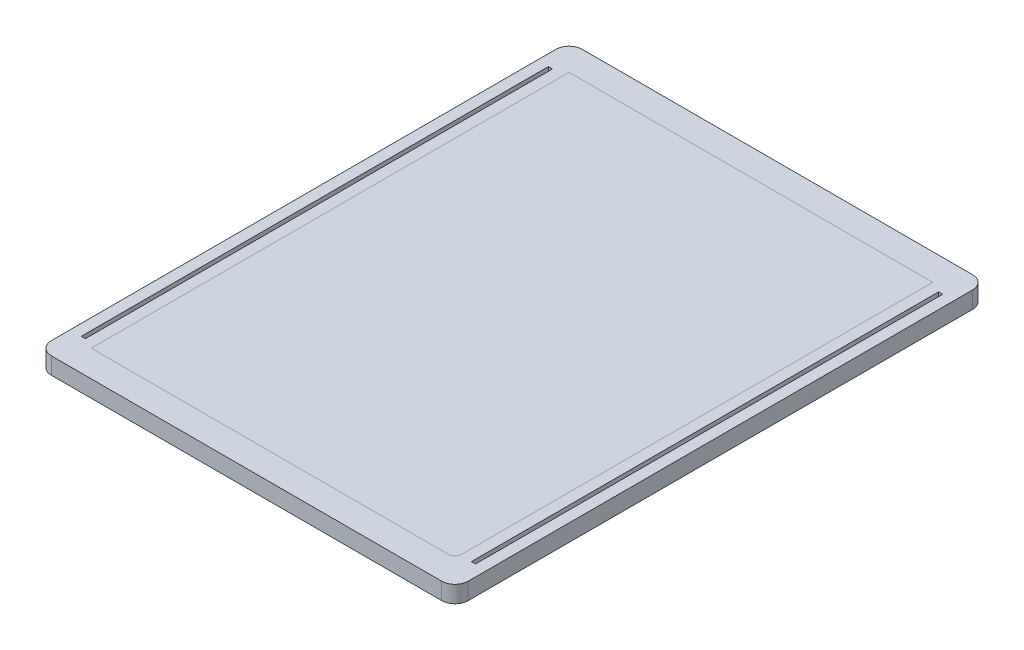
ISO-10303-21;
HEADER;
FILE_DESCRIPTION(('STEP AP214'),'2;1');
FILE_NAME('part.step','',(''),(''),'','','');
FILE_SCHEMA(('AUTOMOTIVE_DESIGN { 1 0 10303 214 1 1 1 1 }'));
ENDSEC;
DATA;
#1=APPLICATION_CONTEXT('core data for automotive mechanical design processes');
#2=APPLICATION_PROTOCOL_DEFINITION('international standard','automotive_design',2000,#1);
#3=PRODUCT_CONTEXT('',#1,'mechanical');
#4=PRODUCT('Part','Part','',(#3));
#5=PRODUCT_RELATED_PRODUCT_CATEGORY('part','',(#4));
#6=PRODUCT_DEFINITION_FORMATION('','',#4);
#7=PRODUCT_DEFINITION_CONTEXT('part definition',#1,'design');
#8=PRODUCT_DEFINITION('design','',#6,#7);
#9=PRODUCT_DEFINITION_SHAPE('','',#8);
#10=(LENGTH_UNIT() NAMED_UNIT(*) SI_UNIT(.MILLI.,.METRE.));
#11=(NAMED_UNIT(*) PLANE_ANGLE_UNIT() SI_UNIT($,.RADIAN.));
#12=(NAMED_UNIT(*) SI_UNIT($,.STERADIAN.) SOLID_ANGLE_UNIT());
#13=UNCERTAINTY_MEASURE_WITH_UNIT(LENGTH_MEASURE(1.E-05),#10,'distance_accuracy_value','');
#14=(GEOMETRIC_REPRESENTATION_CONTEXT(3) GLOBAL_UNCERTAINTY_ASSIGNED_CONTEXT((#13)) GLOBAL_UNIT_ASSIGNED_CONTEXT((#10,
#11,#12)) REPRESENTATION_CONTEXT('',''));
#15=CARTESIAN_POINT('',(0.,0.,0.));
#16=DIRECTION('',(0.,0.,1.));
#17=DIRECTION('',(1.,0.,0.));
#18=AXIS2_PLACEMENT_3D('',#15,#16,#17);
#19=CARTESIAN_POINT('',(68.5000000000001,0.,0.));
#20=DIRECTION('',(-1.,0.,0.));
#21=DIRECTION('',(0.,0.,1.));
#22=AXIS2_PLACEMENT_3D('',#19,#20,#21);
#23=PLANE('',#22);
#24=DIRECTION('',(0.,-1.,0.));
#25=VECTOR('',#24,1.);
#26=CARTESIAN_POINT('',(68.5000000000001,3.175,-90.));
#27=LINE('',#26,#25);
#28=CARTESIAN_POINT('',(68.5000000000001,3.175,-90.));
#29=VERTEX_POINT('',#28);
#30=CARTESIAN_POINT('',(68.5000000000001,-3.175,-90.));
#31=VERTEX_POINT('',#30);
#32=EDGE_CURVE('E99',#29,#31,#27,.T.);
#33=ORIENTED_EDGE('',*,*,#32,.F.);
#34=DIRECTION('',(0.,0.,-1.));
#35=VECTOR('',#34,1.);
#36=CARTESIAN_POINT('',(68.5,3.175,90.));
#37=LINE('',#36,#35);
#38=CARTESIAN_POINT('',(68.5,3.175,90.));
#39=VERTEX_POINT('',#38);
#40=EDGE_CURVE('E110',#39,#29,#37,.T.);
#41=ORIENTED_EDGE('',*,*,#40,.F.);
#42=DIRECTION('',(0.,1.,0.));
#43=VECTOR('',#42,1.);
#44=CARTESIAN_POINT('',(68.5,-3.175,90.));
#45=LINE('',#44,#43);
#46=CARTESIAN_POINT('',(68.5,-3.175,90.));
#47=VERTEX_POINT('',#46);
#48=EDGE_CURVE('E101',#47,#39,#45,.T.);
#49=ORIENTED_EDGE('',*,*,#48,.F.);
#50=DIRECTION('',(0.,0.,1.));
#51=VECTOR('',#50,1.);
#52=CARTESIAN_POINT('',(68.5000000000001,-3.175,-90.));
#53=LINE('',#52,#51);
#54=EDGE_CURVE('E91',#31,#47,#53,.T.);
#55=ORIENTED_EDGE('',*,*,#54,.F.);
#56=EDGE_LOOP('',(#33,#41,#49,#55));
#57=FACE_BOUND('',#56,.T.);
#58=ADVANCED_FACE('F49',(#57),#23,.F.);
#59=CARTESIAN_POINT('',(-248.611972117347,3.175,90.));
#60=DIRECTION('',(0.,-1.,0.));
#61=DIRECTION('',(0.,0.,-1.));
#62=AXIS2_PLACEMENT_3D('',#59,#60,#61);
#63=PLANE('',#62);
#64=DIRECTION('',(1.,0.,0.));
#65=VECTOR('',#64,1.);
#66=CARTESIAN_POINT('',(-248.611972117347,3.175,-90.));
#67=LINE('',#66,#65);
#68=CARTESIAN_POINT('',(-68.5,3.175,-90.));
#69=VERTEX_POINT('',#68);
#70=EDGE_CURVE('E104',#69,#29,#67,.T.);
#71=ORIENTED_EDGE('',*,*,#70,.F.);
#72=DIRECTION('',(0.,0.,1.));
#73=VECTOR('',#72,1.);
#74=CARTESIAN_POINT('',(-68.5,3.175,90.));
#75=LINE('',#74,#73);
#76=CARTESIAN_POINT('',(-68.5,3.175,90.));
#77=VERTEX_POINT('',#76);
#78=EDGE_CURVE('E53',#69,#77,#75,.T.);
#79=ORIENTED_EDGE('',*,*,#78,.T.);
#80=DIRECTION('',(1.,0.,0.));
#81=VECTOR('',#80,1.);
#82=CARTESIAN_POINT('',(-248.611972117347,3.175,90.));
#83=LINE('',#82,#81);
#84=EDGE_CURVE('E113',#77,#39,#83,.T.);
#85=ORIENTED_EDGE('',*,*,#84,.T.);
#86=ORIENTED_EDGE('',*,*,#40,.T.);
#87=EDGE_LOOP('',(#71,#79,#85,#86));
#88=FACE_BOUND('',#87,.T.);
#89=ADVANCED_FACE('F122',(#88),#63,.F.);
#90=CARTESIAN_POINT('',(-248.611972117347,-3.175,90.));
#91=DIRECTION('',(0.,0.,-1.));
#92=DIRECTION('',(-1.,0.,0.));
#93=AXIS2_PLACEMENT_3D('',#90,#91,#92);
#94=PLANE('',#93);
#95=ORIENTED_EDGE('',*,*,#84,.F.);
#96=DIRECTION('',(0.,-1.,0.));
#97=VECTOR('',#96,1.);
#98=CARTESIAN_POINT('',(-68.5,-3.175,90.));
#99=LINE('',#98,#97);
#100=CARTESIAN_POINT('',(-68.5,-3.175,90.));
#101=VERTEX_POINT('',#100);
#102=EDGE_CURVE('E119',#77,#101,#99,.T.);
#103=ORIENTED_EDGE('',*,*,#102,.T.);
#104=DIRECTION('',(1.,0.,0.));
#105=VECTOR('',#104,1.);
#106=CARTESIAN_POINT('',(-248.611972117347,-3.175,90.));
#107=LINE('',#106,#105);
#108=EDGE_CURVE('E95',#101,#47,#107,.T.);
#109=ORIENTED_EDGE('',*,*,#108,.T.);
#110=ORIENTED_EDGE('',*,*,#48,.T.);
#111=EDGE_LOOP('',(#95,#103,#109,#110));
#112=FACE_BOUND('',#111,.T.);
#113=ADVANCED_FACE('F118',(#112),#94,.F.);
#114=CARTESIAN_POINT('',(-248.611972117347,-3.175,-90.));
#115=DIRECTION('',(0.,1.,0.));
#116=DIRECTION('',(0.,0.,1.));
#117=AXIS2_PLACEMENT_3D('',#114,#115,#116);
#118=PLANE('',#117);
#119=ORIENTED_EDGE('',*,*,#108,.F.);
#120=DIRECTION('',(0.,0.,-1.));
#121=VECTOR('',#120,1.);
#122=CARTESIAN_POINT('',(-68.5,-3.175,-90.));
#123=LINE('',#122,#121);
#124=CARTESIAN_POINT('',(-68.5,-3.175,-90.));
#125=VERTEX_POINT('',#124);
#126=EDGE_CURVE('E58',#101,#125,#123,.T.);
#127=ORIENTED_EDGE('',*,*,#126,.T.);
#128=DIRECTION('',(1.,0.,0.));
#129=VECTOR('',#128,1.);
#130=CARTESIAN_POINT('',(-248.611972117347,-3.175,-90.));
#131=LINE('',#130,#129);
#132=EDGE_CURVE('E88',#125,#31,#131,.T.);
#133=ORIENTED_EDGE('',*,*,#132,.T.);
#134=ORIENTED_EDGE('',*,*,#54,.T.);
#135=EDGE_LOOP('',(#119,#127,#133,#134));
#136=FACE_BOUND('',#135,.T.);
#137=ADVANCED_FACE('F90',(#136),#118,.F.);
#138=CARTESIAN_POINT('',(-248.611972117347,3.175,-90.));
#139=DIRECTION('',(0.,0.,1.));
#140=DIRECTION('',(1.,0.,0.));
#141=AXIS2_PLACEMENT_3D('',#138,#139,#140);
#142=PLANE('',#141);
#143=ORIENTED_EDGE('',*,*,#132,.F.);
#144=DIRECTION('',(0.,1.,0.));
#145=VECTOR('',#144,1.);
#146=CARTESIAN_POINT('',(-68.5,3.175,-90.));
#147=LINE('',#146,#145);
#148=EDGE_CURVE('E12',#125,#69,#147,.T.);
#149=ORIENTED_EDGE('',*,*,#148,.T.);
#150=ORIENTED_EDGE('',*,*,#70,.T.);
#151=ORIENTED_EDGE('',*,*,#32,.T.);
#152=EDGE_LOOP('',(#143,#149,#150,#151));
#153=FACE_BOUND('',#152,.T.);
#154=ADVANCED_FACE('F51',(#153),#142,.F.);
#155=CARTESIAN_POINT('',(-68.5,3.175,90.));
#156=DIRECTION('',(1.,0.,0.));
#157=DIRECTION('',(0.,0.,-1.));
#158=AXIS2_PLACEMENT_3D('',#155,#156,#157);
#159=PLANE('',#158);
#160=ORIENTED_EDGE('',*,*,#126,.F.);
#161=ORIENTED_EDGE('',*,*,#102,.F.);
#162=ORIENTED_EDGE('',*,*,#78,.F.);
#163=ORIENTED_EDGE('',*,*,#148,.F.);
#164=EDGE_LOOP('',(#160,#161,#162,#163));
#165=FACE_BOUND('',#164,.T.);
#166=ADVANCED_FACE('F136',(#165),#159,.F.);
#167=CLOSED_SHELL('',(#58,#89,#113,#137,#154,#166));
#168=MANIFOLD_SOLID_BREP('B2_NOT_SHOWN',#167);
#169=CARTESIAN_POINT('',(0.,3.175,0.));
#170=DIRECTION('',(0.,-1.,0.));
#171=DIRECTION('',(0.,0.,-1.));
#172=AXIS2_PLACEMENT_3D('',#169,#170,#171);
#173=PLANE('',#172);
#174=DIRECTION('',(0.,0.,1.));
#175=VECTOR('',#174,1.);
#176=CARTESIAN_POINT('',(-68.5,3.175,90.));
#177=LINE('',#176,#175);
#178=CARTESIAN_POINT('',(-68.5,3.175,-87.4999999999999));
#179=VERTEX_POINT('',#178);
#180=CARTESIAN_POINT('',(-68.5,3.175,87.5));
#181=VERTEX_POINT('',#180);
#182=EDGE_CURVE('E409',#179,#181,#177,.T.);
#183=ORIENTED_EDGE('',*,*,#182,.F.);
#184=CARTESIAN_POINT('',(-66.,3.175,-87.5));
#185=DIRECTION('',(0.,-1.,0.));
#186=DIRECTION('',(0.,0.,-1.));
#187=AXIS2_PLACEMENT_3D('',#184,#185,#186);
#188=CIRCLE('',#187,2.5);
#189=CARTESIAN_POINT('',(-66.,3.175,-90.));
#190=VERTEX_POINT('',#189);
#191=EDGE_CURVE('E47',#179,#190,#188,.T.);
#192=ORIENTED_EDGE('',*,*,#191,.T.);
#193=DIRECTION('',(-1.,0.,0.));
#194=VECTOR('',#193,1.);
#195=CARTESIAN_POINT('',(-68.5,3.175,-90.));
#196=LINE('',#195,#194);
#197=CARTESIAN_POINT('',(66.,3.175,-90.));
#198=VERTEX_POINT('',#197);
#199=EDGE_CURVE('E419',#198,#190,#196,.T.);
#200=ORIENTED_EDGE('',*,*,#199,.F.);
#201=CARTESIAN_POINT('',(66.0000000000001,3.175,-87.5));
#202=DIRECTION('',(0.,-1.,0.));
#203=DIRECTION('',(0.,0.,-1.));
#204=AXIS2_PLACEMENT_3D('',#201,#202,#203);
#205=CIRCLE('',#204,2.5);
#206=CARTESIAN_POINT('',(68.5000000000001,3.175,-87.4999999999999));
#207=VERTEX_POINT('',#206);
#208=EDGE_CURVE('E520',#198,#207,#205,.T.);
#209=ORIENTED_EDGE('',*,*,#208,.T.);
#210=DIRECTION('',(0.,0.,-1.));
#211=VECTOR('',#210,1.);
#212=CARTESIAN_POINT('',(68.5000000000001,3.175,90.));
#213=LINE('',#212,#211);
#214=CARTESIAN_POINT('',(68.5000000000001,3.175,87.5));
#215=VERTEX_POINT('',#214);
#216=EDGE_CURVE('E416',#215,#207,#213,.T.);
#217=ORIENTED_EDGE('',*,*,#216,.F.);
#218=CARTESIAN_POINT('',(66.0000000000001,3.175,87.5));
#219=DIRECTION('',(0.,-1.,0.));
#220=DIRECTION('',(0.,0.,-1.));
#221=AXIS2_PLACEMENT_3D('',#218,#219,#220);
#222=CIRCLE('',#221,2.5);
#223=CARTESIAN_POINT('',(66.0000000000001,3.175,90.));
#224=VERTEX_POINT('',#223);
#225=EDGE_CURVE('E516',#215,#224,#222,.T.);
#226=ORIENTED_EDGE('',*,*,#225,.T.);
#227=DIRECTION('',(1.,0.,0.));
#228=VECTOR('',#227,1.);
#229=CARTESIAN_POINT('',(-68.5,3.175,90.));
#230=LINE('',#229,#228);
#231=CARTESIAN_POINT('',(-66.,3.175,90.));
#232=VERTEX_POINT('',#231);
#233=EDGE_CURVE('E412',#232,#224,#230,.T.);
#234=ORIENTED_EDGE('',*,*,#233,.F.);
#235=CARTESIAN_POINT('',(-66.,3.175,87.5));
#236=DIRECTION('',(0.,-1.,0.));
#237=DIRECTION('',(0.,0.,-1.));
#238=AXIS2_PLACEMENT_3D('',#235,#236,#237);
#239=CIRCLE('',#238,2.5);
#240=EDGE_CURVE('E512',#232,#181,#239,.T.);
#241=ORIENTED_EDGE('',*,*,#240,.T.);
#242=EDGE_LOOP('',(#183,#192,#200,#209,#217,#226,#234,#241));
#243=FACE_BOUND('',#242,.T.);
#244=DIRECTION('',(-1.,0.,0.));
#245=VECTOR('',#244,1.);
#246=CARTESIAN_POINT('',(-78.5,3.175,-100.));
#247=LINE('',#246,#245);
#248=CARTESIAN_POINT('',(73.5,3.175,-100.));
#249=VERTEX_POINT('',#248);
#250=CARTESIAN_POINT('',(-73.5,3.175,-100.));
#251=VERTEX_POINT('',#250);
#252=EDGE_CURVE('E435',#249,#251,#247,.T.);
#253=ORIENTED_EDGE('',*,*,#252,.T.);
#254=CARTESIAN_POINT('',(-73.5,3.175,-95.));
#255=DIRECTION('',(0.,-1.,0.));
#256=DIRECTION('',(0.,0.,-1.));
#257=AXIS2_PLACEMENT_3D('',#254,#255,#256);
#258=CIRCLE('',#257,5.);
#259=CARTESIAN_POINT('',(-78.5,3.175,-95.));
#260=VERTEX_POINT('',#259);
#261=EDGE_CURVE('E479',#251,#260,#258,.F.);
#262=ORIENTED_EDGE('',*,*,#261,.T.);
#263=DIRECTION('',(0.,0.,1.));
#264=VECTOR('',#263,1.);
#265=CARTESIAN_POINT('',(-78.5,3.175,100.));
#266=LINE('',#265,#264);
#267=CARTESIAN_POINT('',(-78.5,3.175,95.));
#268=VERTEX_POINT('',#267);
#269=EDGE_CURVE('E439',#260,#268,#266,.T.);
#270=ORIENTED_EDGE('',*,*,#269,.T.);
#271=CARTESIAN_POINT('',(-73.5,3.175,95.));
#272=DIRECTION('',(0.,-1.,0.));
#273=DIRECTION('',(0.,0.,-1.));
#274=AXIS2_PLACEMENT_3D('',#271,#272,#273);
#275=CIRCLE('',#274,5.);
#276=CARTESIAN_POINT('',(-73.5,3.175,100.));
#277=VERTEX_POINT('',#276);
#278=EDGE_CURVE('E477',#268,#277,#275,.F.);
#279=ORIENTED_EDGE('',*,*,#278,.T.);
#280=DIRECTION('',(1.,0.,0.));
#281=VECTOR('',#280,1.);
#282=CARTESIAN_POINT('',(-78.5,3.175,100.));
#283=LINE('',#282,#281);
#284=CARTESIAN_POINT('',(73.5000000000001,3.175,100.));
#285=VERTEX_POINT('',#284);
#286=EDGE_CURVE('E442',#277,#285,#283,.T.);
#287=ORIENTED_EDGE('',*,*,#286,.T.);
#288=CARTESIAN_POINT('',(73.5000000000001,3.175,95.));
#289=DIRECTION('',(0.,-1.,0.));
#290=DIRECTION('',(0.,0.,-1.));
#291=AXIS2_PLACEMENT_3D('',#288,#289,#290);
#292=CIRCLE('',#291,5.);
#293=CARTESIAN_POINT('',(78.5000000000001,3.175,95.));
#294=VERTEX_POINT('',#293);
#295=EDGE_CURVE('E475',#285,#294,#292,.F.);
#296=ORIENTED_EDGE('',*,*,#295,.T.);
#297=DIRECTION('',(0.,0.,-1.));
#298=VECTOR('',#297,1.);
#299=CARTESIAN_POINT('',(78.5000000000001,3.175,100.));
#300=LINE('',#299,#298);
#301=CARTESIAN_POINT('',(78.5,3.175,-95.));
#302=VERTEX_POINT('',#301);
#303=EDGE_CURVE('E432',#294,#302,#300,.T.);
#304=ORIENTED_EDGE('',*,*,#303,.T.);
#305=CARTESIAN_POINT('',(73.5,3.175,-95.));
#306=DIRECTION('',(0.,-1.,0.));
#307=DIRECTION('',(0.,0.,-1.));
#308=AXIS2_PLACEMENT_3D('',#305,#306,#307);
#309=CIRCLE('',#308,5.);
#310=EDGE_CURVE('E473',#302,#249,#309,.F.);
#311=ORIENTED_EDGE('',*,*,#310,.T.);
#312=EDGE_LOOP('',(#253,#262,#270,#279,#287,#296,#304,#311));
#313=FACE_BOUND('',#312,.T.);
#314=DIRECTION('',(-1.,0.,0.));
#315=VECTOR('',#314,1.);
#316=CARTESIAN_POINT('',(-74.277875,3.175,-88.));
#317=LINE('',#316,#315);
#318=CARTESIAN_POINT('',(-72.722125,3.175,-88.));
#319=VERTEX_POINT('',#318);
#320=CARTESIAN_POINT('',(-74.277875,3.175,-88.));
#321=VERTEX_POINT('',#320);
#322=EDGE_CURVE('E387',#319,#321,#317,.T.);
#323=ORIENTED_EDGE('',*,*,#322,.F.);
#324=DIRECTION('',(0.,0.,-1.));
#325=VECTOR('',#324,1.);
#326=CARTESIAN_POINT('',(-72.722125,3.175,88.));
#327=LINE('',#326,#325);
#328=CARTESIAN_POINT('',(-72.722125,3.175,88.));
#329=VERTEX_POINT('',#328);
#330=EDGE_CURVE('E385',#329,#319,#327,.T.);
#331=ORIENTED_EDGE('',*,*,#330,.F.);
#332=DIRECTION('',(1.,0.,0.));
#333=VECTOR('',#332,1.);
#334=CARTESIAN_POINT('',(-74.277875,3.175,88.));
#335=LINE('',#334,#333);
#336=CARTESIAN_POINT('',(-74.277875,3.175,88.));
#337=VERTEX_POINT('',#336);
#338=EDGE_CURVE('E393',#337,#329,#335,.T.);
#339=ORIENTED_EDGE('',*,*,#338,.F.);
#340=DIRECTION('',(0.,0.,1.));
#341=VECTOR('',#340,1.);
#342=CARTESIAN_POINT('',(-74.277875,3.175,88.));
#343=LINE('',#342,#341);
#344=EDGE_CURVE('E390',#321,#337,#343,.T.);
#345=ORIENTED_EDGE('',*,*,#344,.F.);
#346=EDGE_LOOP('',(#323,#331,#339,#345));
#347=FACE_BOUND('',#346,.T.);
#348=DIRECTION('',(0.,0.,-1.));
#349=VECTOR('',#348,1.);
#350=CARTESIAN_POINT('',(72.722125,3.175,88.));
#351=LINE('',#350,#349);
#352=CARTESIAN_POINT('',(72.722125,3.175,88.));
#353=VERTEX_POINT('',#352);
#354=CARTESIAN_POINT('',(72.722125,3.175,-88.));
#355=VERTEX_POINT('',#354);
#356=EDGE_CURVE('E341',#353,#355,#351,.T.);
#357=ORIENTED_EDGE('',*,*,#356,.T.);
#358=DIRECTION('',(1.,0.,0.));
#359=VECTOR('',#358,1.);
#360=CARTESIAN_POINT('',(74.277875,3.175,-88.));
#361=LINE('',#360,#359);
#362=CARTESIAN_POINT('',(74.277875,3.175,-88.));
#363=VERTEX_POINT('',#362);
#364=EDGE_CURVE('E346',#355,#363,#361,.T.);
#365=ORIENTED_EDGE('',*,*,#364,.T.);
#366=DIRECTION('',(0.,0.,1.));
#367=VECTOR('',#366,1.);
#368=CARTESIAN_POINT('',(74.277875,3.175,88.));
#369=LINE('',#368,#367);
#370=CARTESIAN_POINT('',(74.277875,3.175,88.));
#371=VERTEX_POINT('',#370);
#372=EDGE_CURVE('E368',#363,#371,#369,.T.);
#373=ORIENTED_EDGE('',*,*,#372,.T.);
#374=DIRECTION('',(-1.,0.,0.));
#375=VECTOR('',#374,1.);
#376=CARTESIAN_POINT('',(74.277875,3.175,88.));
#377=LINE('',#376,#375);
#378=EDGE_CURVE('E361',#371,#353,#377,.T.);
#379=ORIENTED_EDGE('',*,*,#378,.T.);
#380=EDGE_LOOP('',(#357,#365,#373,#379));
#381=FACE_BOUND('',#380,.T.);
#382=ADVANCED_FACE('F173',(#243,#313,#347,#381),#173,.F.);
#383=CARTESIAN_POINT('',(0.,-3.175,0.));
#384=DIRECTION('',(0.,-1.,0.));
#385=DIRECTION('',(0.,0.,-1.));
#386=AXIS2_PLACEMENT_3D('',#383,#384,#385);
#387=PLANE('',#386);
#388=DIRECTION('',(0.,0.,-1.));
#389=VECTOR('',#388,1.);
#390=CARTESIAN_POINT('',(-72.722125,-3.175,88.));
#391=LINE('',#390,#389);
#392=CARTESIAN_POINT('',(-72.722125,-3.175,88.));
#393=VERTEX_POINT('',#392);
#394=CARTESIAN_POINT('',(-72.722125,-3.175,-88.));
#395=VERTEX_POINT('',#394);
#396=EDGE_CURVE('E382',#393,#395,#391,.T.);
#397=ORIENTED_EDGE('',*,*,#396,.T.);
#398=DIRECTION('',(-1.,0.,0.));
#399=VECTOR('',#398,1.);
#400=CARTESIAN_POINT('',(-74.277875,-3.175,-88.));
#401=LINE('',#400,#399);
#402=CARTESIAN_POINT('',(-74.277875,-3.175,-88.));
#403=VERTEX_POINT('',#402);
#404=EDGE_CURVE('E399',#395,#403,#401,.T.);
#405=ORIENTED_EDGE('',*,*,#404,.T.);
#406=DIRECTION('',(0.,0.,1.));
#407=VECTOR('',#406,1.);
#408=CARTESIAN_POINT('',(-74.277875,-3.175,88.));
#409=LINE('',#408,#407);
#410=CARTESIAN_POINT('',(-74.277875,-3.175,88.));
#411=VERTEX_POINT('',#410);
#412=EDGE_CURVE('E354',#403,#411,#409,.T.);
#413=ORIENTED_EDGE('',*,*,#412,.T.);
#414=DIRECTION('',(1.,0.,0.));
#415=VECTOR('',#414,1.);
#416=CARTESIAN_POINT('',(-74.277875,-3.175,88.));
#417=LINE('',#416,#415);
#418=EDGE_CURVE('E379',#411,#393,#417,.T.);
#419=ORIENTED_EDGE('',*,*,#418,.T.);
#420=EDGE_LOOP('',(#397,#405,#413,#419));
#421=FACE_BOUND('',#420,.T.);
#422=DIRECTION('',(0.,0.,1.));
#423=VECTOR('',#422,1.);
#424=CARTESIAN_POINT('',(-78.5,-3.175,100.));
#425=LINE('',#424,#423);
#426=CARTESIAN_POINT('',(-78.5,-3.175,-95.));
#427=VERTEX_POINT('',#426);
#428=CARTESIAN_POINT('',(-78.5,-3.175,95.));
#429=VERTEX_POINT('',#428);
#430=EDGE_CURVE('E451',#427,#429,#425,.T.);
#431=ORIENTED_EDGE('',*,*,#430,.F.);
#432=CARTESIAN_POINT('',(-73.5,-3.175,-95.));
#433=DIRECTION('',(0.,-1.,0.));
#434=DIRECTION('',(0.,0.,-1.));
#435=AXIS2_PLACEMENT_3D('',#432,#433,#434);
#436=CIRCLE('',#435,5.);
#437=CARTESIAN_POINT('',(-73.5,-3.175,-100.));
#438=VERTEX_POINT('',#437);
#439=EDGE_CURVE('E466',#427,#438,#436,.T.);
#440=ORIENTED_EDGE('',*,*,#439,.T.);
#441=DIRECTION('',(-1.,0.,0.));
#442=VECTOR('',#441,1.);
#443=CARTESIAN_POINT('',(-78.5,-3.175,-100.));
#444=LINE('',#443,#442);
#445=CARTESIAN_POINT('',(73.5,-3.175,-100.));
#446=VERTEX_POINT('',#445);
#447=EDGE_CURVE('E448',#446,#438,#444,.T.);
#448=ORIENTED_EDGE('',*,*,#447,.F.);
#449=CARTESIAN_POINT('',(73.5,-3.175,-95.));
#450=DIRECTION('',(0.,-1.,0.));
#451=DIRECTION('',(0.,0.,-1.));
#452=AXIS2_PLACEMENT_3D('',#449,#450,#451);
#453=CIRCLE('',#452,5.);
#454=CARTESIAN_POINT('',(78.5,-3.175,-95.));
#455=VERTEX_POINT('',#454);
#456=EDGE_CURVE('E460',#446,#455,#453,.T.);
#457=ORIENTED_EDGE('',*,*,#456,.T.);
#458=DIRECTION('',(0.,0.,-1.));
#459=VECTOR('',#458,1.);
#460=CARTESIAN_POINT('',(78.5000000000001,-3.175,100.));
#461=LINE('',#460,#459);
#462=CARTESIAN_POINT('',(78.5000000000001,-3.175,95.));
#463=VERTEX_POINT('',#462);
#464=EDGE_CURVE('E421',#463,#455,#461,.T.);
#465=ORIENTED_EDGE('',*,*,#464,.F.);
#466=CARTESIAN_POINT('',(73.5000000000001,-3.175,95.));
#467=DIRECTION('',(0.,-1.,0.));
#468=DIRECTION('',(0.,0.,-1.));
#469=AXIS2_PLACEMENT_3D('',#466,#467,#468);
#470=CIRCLE('',#469,5.);
#471=CARTESIAN_POINT('',(73.5000000000001,-3.175,100.));
#472=VERTEX_POINT('',#471);
#473=EDGE_CURVE('E462',#463,#472,#470,.T.);
#474=ORIENTED_EDGE('',*,*,#473,.T.);
#475=DIRECTION('',(1.,0.,0.));
#476=VECTOR('',#475,1.);
#477=CARTESIAN_POINT('',(-78.5,-3.175,100.));
#478=LINE('',#477,#476);
#479=CARTESIAN_POINT('',(-73.5,-3.175,100.));
#480=VERTEX_POINT('',#479);
#481=EDGE_CURVE('E436',#480,#472,#478,.T.);
#482=ORIENTED_EDGE('',*,*,#481,.F.);
#483=CARTESIAN_POINT('',(-73.5,-3.175,95.));
#484=DIRECTION('',(0.,-1.,0.));
#485=DIRECTION('',(0.,0.,-1.));
#486=AXIS2_PLACEMENT_3D('',#483,#484,#485);
#487=CIRCLE('',#486,5.);
#488=EDGE_CURVE('E464',#480,#429,#487,.T.);
#489=ORIENTED_EDGE('',*,*,#488,.T.);
#490=EDGE_LOOP('',(#431,#440,#448,#457,#465,#474,#482,#489));
#491=FACE_BOUND('',#490,.T.);
#492=DIRECTION('',(0.,0.,-1.));
#493=VECTOR('',#492,1.);
#494=CARTESIAN_POINT('',(68.5000000000001,-3.175,90.));
#495=LINE('',#494,#493);
#496=CARTESIAN_POINT('',(68.5000000000001,-3.175,87.5));
#497=VERTEX_POINT('',#496);
#498=CARTESIAN_POINT('',(68.5000000000001,-3.175,-87.4999999999999));
#499=VERTEX_POINT('',#498);
#500=EDGE_CURVE('E427',#497,#499,#495,.T.);
#501=ORIENTED_EDGE('',*,*,#500,.T.);
#502=CARTESIAN_POINT('',(66.0000000000001,-3.175,-87.5));
#503=DIRECTION('',(0.,-1.,0.));
#504=DIRECTION('',(0.,0.,-1.));
#505=AXIS2_PLACEMENT_3D('',#502,#503,#504);
#506=CIRCLE('',#505,2.5);
#507=CARTESIAN_POINT('',(66.,-3.175,-90.));
#508=VERTEX_POINT('',#507);
#509=EDGE_CURVE('E518',#499,#508,#506,.F.);
#510=ORIENTED_EDGE('',*,*,#509,.T.);
#511=DIRECTION('',(-1.,0.,0.));
#512=VECTOR('',#511,1.);
#513=CARTESIAN_POINT('',(-68.5,-3.175,-90.));
#514=LINE('',#513,#512);
#515=CARTESIAN_POINT('',(-66.,-3.175,-90.));
#516=VERTEX_POINT('',#515);
#517=EDGE_CURVE('E413',#508,#516,#514,.T.);
#518=ORIENTED_EDGE('',*,*,#517,.T.);
#519=CARTESIAN_POINT('',(-66.,-3.175,-87.5));
#520=DIRECTION('',(0.,-1.,0.));
#521=DIRECTION('',(0.,0.,-1.));
#522=AXIS2_PLACEMENT_3D('',#519,#520,#521);
#523=CIRCLE('',#522,2.5);
#524=CARTESIAN_POINT('',(-68.5,-3.175,-87.4999999999999));
#525=VERTEX_POINT('',#524);
#526=EDGE_CURVE('E181',#516,#525,#523,.F.);
#527=ORIENTED_EDGE('',*,*,#526,.T.);
#528=DIRECTION('',(0.,0.,1.));
#529=VECTOR('',#528,1.);
#530=CARTESIAN_POINT('',(-68.5,-3.175,90.));
#531=LINE('',#530,#529);
#532=CARTESIAN_POINT('',(-68.5,-3.175,87.5));
#533=VERTEX_POINT('',#532);
#534=EDGE_CURVE('E408',#525,#533,#531,.T.);
#535=ORIENTED_EDGE('',*,*,#534,.T.);
#536=CARTESIAN_POINT('',(-66.,-3.175,87.5));
#537=DIRECTION('',(0.,-1.,0.));
#538=DIRECTION('',(0.,0.,-1.));
#539=AXIS2_PLACEMENT_3D('',#536,#537,#538);
#540=CIRCLE('',#539,2.5);
#541=CARTESIAN_POINT('',(-66.,-3.175,90.));
#542=VERTEX_POINT('',#541);
#543=EDGE_CURVE('E510',#533,#542,#540,.F.);
#544=ORIENTED_EDGE('',*,*,#543,.T.);
#545=DIRECTION('',(1.,0.,0.));
#546=VECTOR('',#545,1.);
#547=CARTESIAN_POINT('',(-68.5,-3.175,90.));
#548=LINE('',#547,#546);
#549=CARTESIAN_POINT('',(66.0000000000001,-3.175,90.));
#550=VERTEX_POINT('',#549);
#551=EDGE_CURVE('E424',#542,#550,#548,.T.);
#552=ORIENTED_EDGE('',*,*,#551,.T.);
#553=CARTESIAN_POINT('',(66.0000000000001,-3.175,87.5));
#554=DIRECTION('',(0.,-1.,0.));
#555=DIRECTION('',(0.,0.,-1.));
#556=AXIS2_PLACEMENT_3D('',#553,#554,#555);
#557=CIRCLE('',#556,2.5);
#558=EDGE_CURVE('E514',#550,#497,#557,.F.);
#559=ORIENTED_EDGE('',*,*,#558,.T.);
#560=EDGE_LOOP('',(#501,#510,#518,#527,#535,#544,#552,#559));
#561=FACE_BOUND('',#560,.T.);
#562=DIRECTION('',(1.,0.,0.));
#563=VECTOR('',#562,1.);
#564=CARTESIAN_POINT('',(74.277875,-3.175,-88.));
#565=LINE('',#564,#563);
#566=CARTESIAN_POINT('',(72.722125,-3.175,-88.));
#567=VERTEX_POINT('',#566);
#568=CARTESIAN_POINT('',(74.277875,-3.175,-88.));
#569=VERTEX_POINT('',#568);
#570=EDGE_CURVE('E359',#567,#569,#565,.T.);
#571=ORIENTED_EDGE('',*,*,#570,.F.);
#572=DIRECTION('',(0.,0.,-1.));
#573=VECTOR('',#572,1.);
#574=CARTESIAN_POINT('',(72.722125,-3.175,88.));
#575=LINE('',#574,#573);
#576=CARTESIAN_POINT('',(72.722125,-3.175,88.));
#577=VERTEX_POINT('',#576);
#578=EDGE_CURVE('E338',#577,#567,#575,.T.);
#579=ORIENTED_EDGE('',*,*,#578,.F.);
#580=DIRECTION('',(-1.,0.,0.));
#581=VECTOR('',#580,1.);
#582=CARTESIAN_POINT('',(74.277875,-3.175,88.));
#583=LINE('',#582,#581);
#584=CARTESIAN_POINT('',(74.277875,-3.175,88.));
#585=VERTEX_POINT('',#584);
#586=EDGE_CURVE('E350',#585,#577,#583,.T.);
#587=ORIENTED_EDGE('',*,*,#586,.F.);
#588=DIRECTION('',(0.,0.,1.));
#589=VECTOR('',#588,1.);
#590=CARTESIAN_POINT('',(74.277875,-3.175,88.));
#591=LINE('',#590,#589);
#592=EDGE_CURVE('E363',#569,#585,#591,.T.);
#593=ORIENTED_EDGE('',*,*,#592,.F.);
#594=EDGE_LOOP('',(#571,#579,#587,#593));
#595=FACE_BOUND('',#594,.T.);
#596=ADVANCED_FACE('F357',(#421,#491,#561,#595),#387,.T.);
#597=CARTESIAN_POINT('',(78.5000000000001,3.175,100.));
#598=DIRECTION('',(-1.,0.,0.));
#599=DIRECTION('',(0.,0.,1.));
#600=AXIS2_PLACEMENT_3D('',#597,#598,#599);
#601=PLANE('',#600);
#602=ORIENTED_EDGE('',*,*,#303,.F.);
#603=DIRECTION('',(0.,-1.,0.));
#604=VECTOR('',#603,1.);
#605=CARTESIAN_POINT('',(78.5000000000001,3.175,95.));
#606=LINE('',#605,#604);
#607=EDGE_CURVE('E488',#294,#463,#606,.T.);
#608=ORIENTED_EDGE('',*,*,#607,.T.);
#609=ORIENTED_EDGE('',*,*,#464,.T.);
#610=DIRECTION('',(0.,-1.,0.));
#611=VECTOR('',#610,1.);
#612=CARTESIAN_POINT('',(78.5,3.175,-95.));
#613=LINE('',#612,#611);
#614=EDGE_CURVE('E486',#455,#302,#613,.F.);
#615=ORIENTED_EDGE('',*,*,#614,.T.);
#616=EDGE_LOOP('',(#602,#608,#609,#615));
#617=FACE_BOUND('',#616,.T.);
#618=ADVANCED_FACE('F568',(#617),#601,.F.);
#619=CARTESIAN_POINT('',(-78.5,3.175,-100.));
#620=DIRECTION('',(0.,0.,1.));
#621=DIRECTION('',(1.,0.,0.));
#622=AXIS2_PLACEMENT_3D('',#619,#620,#621);
#623=PLANE('',#622);
#624=ORIENTED_EDGE('',*,*,#447,.T.);
#625=DIRECTION('',(0.,-1.,0.));
#626=VECTOR('',#625,1.);
#627=CARTESIAN_POINT('',(-73.5,3.175,-100.));
#628=LINE('',#627,#626);
#629=EDGE_CURVE('E471',#438,#251,#628,.F.);
#630=ORIENTED_EDGE('',*,*,#629,.T.);
#631=ORIENTED_EDGE('',*,*,#252,.F.);
#632=DIRECTION('',(0.,-1.,0.));
#633=VECTOR('',#632,1.);
#634=CARTESIAN_POINT('',(73.5,3.175,-100.));
#635=LINE('',#634,#633);
#636=EDGE_CURVE('E468',#249,#446,#635,.T.);
#637=ORIENTED_EDGE('',*,*,#636,.T.);
#638=EDGE_LOOP('',(#624,#630,#631,#637));
#639=FACE_BOUND('',#638,.T.);
#640=ADVANCED_FACE('F581',(#639),#623,.F.);
#641=CARTESIAN_POINT('',(-78.5,3.175,100.));
#642=DIRECTION('',(1.,0.,0.));
#643=DIRECTION('',(0.,0.,-1.));
#644=AXIS2_PLACEMENT_3D('',#641,#642,#643);
#645=PLANE('',#644);
#646=ORIENTED_EDGE('',*,*,#269,.F.);
#647=DIRECTION('',(0.,-1.,0.));
#648=VECTOR('',#647,1.);
#649=CARTESIAN_POINT('',(-78.5,3.175,-95.));
#650=LINE('',#649,#648);
#651=EDGE_CURVE('E457',#260,#427,#650,.T.);
#652=ORIENTED_EDGE('',*,*,#651,.T.);
#653=ORIENTED_EDGE('',*,*,#430,.T.);
#654=DIRECTION('',(0.,-1.,0.));
#655=VECTOR('',#654,1.);
#656=CARTESIAN_POINT('',(-78.5,3.175,95.));
#657=LINE('',#656,#655);
#658=EDGE_CURVE('E445',#429,#268,#657,.F.);
#659=ORIENTED_EDGE('',*,*,#658,.T.);
#660=EDGE_LOOP('',(#646,#652,#653,#659));
#661=FACE_BOUND('',#660,.T.);
#662=ADVANCED_FACE('F577',(#661),#645,.F.);
#663=CARTESIAN_POINT('',(-78.5,3.175,100.));
#664=DIRECTION('',(0.,0.,-1.));
#665=DIRECTION('',(-1.,0.,0.));
#666=AXIS2_PLACEMENT_3D('',#663,#664,#665);
#667=PLANE('',#666);
#668=ORIENTED_EDGE('',*,*,#286,.F.);
#669=DIRECTION('',(0.,-1.,0.));
#670=VECTOR('',#669,1.);
#671=CARTESIAN_POINT('',(-73.5,3.175,100.));
#672=LINE('',#671,#670);
#673=EDGE_CURVE('E483',#277,#480,#672,.T.);
#674=ORIENTED_EDGE('',*,*,#673,.T.);
#675=ORIENTED_EDGE('',*,*,#481,.T.);
#676=DIRECTION('',(0.,-1.,0.));
#677=VECTOR('',#676,1.);
#678=CARTESIAN_POINT('',(73.5000000000001,3.175,100.));
#679=LINE('',#678,#677);
#680=EDGE_CURVE('E481',#472,#285,#679,.F.);
#681=ORIENTED_EDGE('',*,*,#680,.T.);
#682=EDGE_LOOP('',(#668,#674,#675,#681));
#683=FACE_BOUND('',#682,.T.);
#684=ADVANCED_FACE('F574',(#683),#667,.F.);
#685=CARTESIAN_POINT('',(-68.5,3.175,90.));
#686=DIRECTION('',(1.,0.,0.));
#687=DIRECTION('',(0.,0.,-1.));
#688=AXIS2_PLACEMENT_3D('',#685,#686,#687);
#689=PLANE('',#688);
#690=ORIENTED_EDGE('',*,*,#182,.T.);
#691=DIRECTION('',(0.,-1.,0.));
#692=VECTOR('',#691,1.);
#693=CARTESIAN_POINT('',(-68.5,-3.175,87.5));
#694=LINE('',#693,#692);
#695=EDGE_CURVE('E493',#181,#533,#694,.T.);
#696=ORIENTED_EDGE('',*,*,#695,.T.);
#697=ORIENTED_EDGE('',*,*,#534,.F.);
#698=DIRECTION('',(0.,-1.,0.));
#699=VECTOR('',#698,1.);
#700=CARTESIAN_POINT('',(-68.5,3.175,-87.5));
#701=LINE('',#700,#699);
#702=EDGE_CURVE('E491',#525,#179,#701,.F.);
#703=ORIENTED_EDGE('',*,*,#702,.T.);
#704=EDGE_LOOP('',(#690,#696,#697,#703));
#705=FACE_BOUND('',#704,.T.);
#706=ADVANCED_FACE('F527',(#705),#689,.T.);
#707=CARTESIAN_POINT('',(-68.5,3.175,90.));
#708=DIRECTION('',(0.,0.,-1.));
#709=DIRECTION('',(-1.,0.,0.));
#710=AXIS2_PLACEMENT_3D('',#707,#708,#709);
#711=PLANE('',#710);
#712=ORIENTED_EDGE('',*,*,#551,.F.);
#713=DIRECTION('',(0.,-1.,0.));
#714=VECTOR('',#713,1.);
#715=CARTESIAN_POINT('',(-66.,3.175,90.));
#716=LINE('',#715,#714);
#717=EDGE_CURVE('E499',#542,#232,#716,.F.);
#718=ORIENTED_EDGE('',*,*,#717,.T.);
#719=ORIENTED_EDGE('',*,*,#233,.T.);
#720=DIRECTION('',(0.,-1.,0.));
#721=VECTOR('',#720,1.);
#722=CARTESIAN_POINT('',(66.0000000000001,-3.175,90.));
#723=LINE('',#722,#721);
#724=EDGE_CURVE('E496',#224,#550,#723,.T.);
#725=ORIENTED_EDGE('',*,*,#724,.T.);
#726=EDGE_LOOP('',(#712,#718,#719,#725));
#727=FACE_BOUND('',#726,.T.);
#728=ADVANCED_FACE('F546',(#727),#711,.T.);
#729=CARTESIAN_POINT('',(68.5000000000001,3.175,90.));
#730=DIRECTION('',(-1.,0.,0.));
#731=DIRECTION('',(0.,0.,1.));
#732=AXIS2_PLACEMENT_3D('',#729,#730,#731);
#733=PLANE('',#732);
#734=ORIENTED_EDGE('',*,*,#500,.F.);
#735=DIRECTION('',(0.,-1.,0.));
#736=VECTOR('',#735,1.);
#737=CARTESIAN_POINT('',(68.5000000000001,3.175,87.5));
#738=LINE('',#737,#736);
#739=EDGE_CURVE('E504',#497,#215,#738,.F.);
#740=ORIENTED_EDGE('',*,*,#739,.T.);
#741=ORIENTED_EDGE('',*,*,#216,.T.);
#742=DIRECTION('',(0.,-1.,0.));
#743=VECTOR('',#742,1.);
#744=CARTESIAN_POINT('',(68.5000000000001,-3.175,-87.5));
#745=LINE('',#744,#743);
#746=EDGE_CURVE('E501',#207,#499,#745,.T.);
#747=ORIENTED_EDGE('',*,*,#746,.T.);
#748=EDGE_LOOP('',(#734,#740,#741,#747));
#749=FACE_BOUND('',#748,.T.);
#750=ADVANCED_FACE('F538',(#749),#733,.T.);
#751=CARTESIAN_POINT('',(-68.5,3.175,-90.));
#752=DIRECTION('',(0.,0.,1.));
#753=DIRECTION('',(1.,0.,0.));
#754=AXIS2_PLACEMENT_3D('',#751,#752,#753);
#755=PLANE('',#754);
#756=ORIENTED_EDGE('',*,*,#517,.F.);
#757=DIRECTION('',(0.,-1.,0.));
#758=VECTOR('',#757,1.);
#759=CARTESIAN_POINT('',(66.0000000000001,3.175,-90.));
#760=LINE('',#759,#758);
#761=EDGE_CURVE('E193',#508,#198,#760,.F.);
#762=ORIENTED_EDGE('',*,*,#761,.T.);
#763=ORIENTED_EDGE('',*,*,#199,.T.);
#764=DIRECTION('',(0.,-1.,0.));
#765=VECTOR('',#764,1.);
#766=CARTESIAN_POINT('',(-66.,-3.175,-90.));
#767=LINE('',#766,#765);
#768=EDGE_CURVE('E506',#190,#516,#767,.T.);
#769=ORIENTED_EDGE('',*,*,#768,.T.);
#770=EDGE_LOOP('',(#756,#762,#763,#769));
#771=FACE_BOUND('',#770,.T.);
#772=ADVANCED_FACE('F529',(#771),#755,.T.);
#773=CARTESIAN_POINT('',(-72.722125,-3.176,88.));
#774=DIRECTION('',(1.,0.,0.));
#775=DIRECTION('',(0.,0.,-1.));
#776=AXIS2_PLACEMENT_3D('',#773,#774,#775);
#777=PLANE('',#776);
#778=DIRECTION('',(0.,1.,0.));
#779=VECTOR('',#778,1.);
#780=CARTESIAN_POINT('',(-72.722125,-3.176,88.));
#781=LINE('',#780,#779);
#782=EDGE_CURVE('E397',#393,#329,#781,.T.);
#783=ORIENTED_EDGE('',*,*,#782,.T.);
#784=ORIENTED_EDGE('',*,*,#330,.T.);
#785=DIRECTION('',(0.,1.,0.));
#786=VECTOR('',#785,1.);
#787=CARTESIAN_POINT('',(-72.722125,-3.176,-88.));
#788=LINE('',#787,#786);
#789=EDGE_CURVE('E396',#395,#319,#788,.T.);
#790=ORIENTED_EDGE('',*,*,#789,.F.);
#791=ORIENTED_EDGE('',*,*,#396,.F.);
#792=EDGE_LOOP('',(#783,#784,#790,#791));
#793=FACE_BOUND('',#792,.T.);
#794=ADVANCED_FACE('F649',(#793),#777,.F.);
#795=CARTESIAN_POINT('',(-74.277875,-3.176,88.));
#796=DIRECTION('',(0.,0.,1.));
#797=DIRECTION('',(1.,0.,0.));
#798=AXIS2_PLACEMENT_3D('',#795,#796,#797);
#799=PLANE('',#798);
#800=DIRECTION('',(0.,1.,0.));
#801=VECTOR('',#800,1.);
#802=CARTESIAN_POINT('',(-74.277875,-3.176,88.));
#803=LINE('',#802,#801);
#804=EDGE_CURVE('E400',#411,#337,#803,.T.);
#805=ORIENTED_EDGE('',*,*,#804,.T.);
#806=ORIENTED_EDGE('',*,*,#338,.T.);
#807=ORIENTED_EDGE('',*,*,#782,.F.);
#808=ORIENTED_EDGE('',*,*,#418,.F.);
#809=EDGE_LOOP('',(#805,#806,#807,#808));
#810=FACE_BOUND('',#809,.T.);
#811=ADVANCED_FACE('F645',(#810),#799,.F.);
#812=CARTESIAN_POINT('',(-74.277875,-3.176,88.));
#813=DIRECTION('',(-1.,0.,0.));
#814=DIRECTION('',(0.,0.,1.));
#815=AXIS2_PLACEMENT_3D('',#812,#813,#814);
#816=PLANE('',#815);
#817=DIRECTION('',(0.,1.,0.));
#818=VECTOR('',#817,1.);
#819=CARTESIAN_POINT('',(-74.277875,-3.176,-88.));
#820=LINE('',#819,#818);
#821=EDGE_CURVE('E402',#403,#321,#820,.T.);
#822=ORIENTED_EDGE('',*,*,#821,.T.);
#823=ORIENTED_EDGE('',*,*,#344,.T.);
#824=ORIENTED_EDGE('',*,*,#804,.F.);
#825=ORIENTED_EDGE('',*,*,#412,.F.);
#826=EDGE_LOOP('',(#822,#823,#824,#825));
#827=FACE_BOUND('',#826,.T.);
#828=ADVANCED_FACE('F648',(#827),#816,.F.);
#829=CARTESIAN_POINT('',(-74.277875,-3.176,-88.));
#830=DIRECTION('',(0.,0.,-1.));
#831=DIRECTION('',(-1.,0.,0.));
#832=AXIS2_PLACEMENT_3D('',#829,#830,#831);
#833=PLANE('',#832);
#834=ORIENTED_EDGE('',*,*,#789,.T.);
#835=ORIENTED_EDGE('',*,*,#322,.T.);
#836=ORIENTED_EDGE('',*,*,#821,.F.);
#837=ORIENTED_EDGE('',*,*,#404,.F.);
#838=EDGE_LOOP('',(#834,#835,#836,#837));
#839=FACE_BOUND('',#838,.T.);
#840=ADVANCED_FACE('F640',(#839),#833,.F.);
#841=CARTESIAN_POINT('',(72.722125,-3.176,88.));
#842=DIRECTION('',(1.,0.,0.));
#843=DIRECTION('',(0.,0.,-1.));
#844=AXIS2_PLACEMENT_3D('',#841,#842,#843);
#845=PLANE('',#844);
#846=ORIENTED_EDGE('',*,*,#578,.T.);
#847=DIRECTION('',(0.,1.,0.));
#848=VECTOR('',#847,1.);
#849=CARTESIAN_POINT('',(72.722125,-3.176,-88.));
#850=LINE('',#849,#848);
#851=EDGE_CURVE('E355',#567,#355,#850,.T.);
#852=ORIENTED_EDGE('',*,*,#851,.T.);
#853=ORIENTED_EDGE('',*,*,#356,.F.);
#854=DIRECTION('',(0.,1.,0.));
#855=VECTOR('',#854,1.);
#856=CARTESIAN_POINT('',(72.722125,-3.176,88.));
#857=LINE('',#856,#855);
#858=EDGE_CURVE('E334',#577,#353,#857,.T.);
#859=ORIENTED_EDGE('',*,*,#858,.F.);
#860=EDGE_LOOP('',(#846,#852,#853,#859));
#861=FACE_BOUND('',#860,.T.);
#862=ADVANCED_FACE('F336',(#861),#845,.T.);
#863=CARTESIAN_POINT('',(74.277875,-3.176,-88.));
#864=DIRECTION('',(0.,0.,1.));
#865=DIRECTION('',(1.,0.,0.));
#866=AXIS2_PLACEMENT_3D('',#863,#864,#865);
#867=PLANE('',#866);
#868=ORIENTED_EDGE('',*,*,#570,.T.);
#869=DIRECTION('',(0.,1.,0.));
#870=VECTOR('',#869,1.);
#871=CARTESIAN_POINT('',(74.277875,-3.176,-88.));
#872=LINE('',#871,#870);
#873=EDGE_CURVE('E374',#569,#363,#872,.T.);
#874=ORIENTED_EDGE('',*,*,#873,.T.);
#875=ORIENTED_EDGE('',*,*,#364,.F.);
#876=ORIENTED_EDGE('',*,*,#851,.F.);
#877=EDGE_LOOP('',(#868,#874,#875,#876));
#878=FACE_BOUND('',#877,.T.);
#879=ADVANCED_FACE('F632',(#878),#867,.T.);
#880=CARTESIAN_POINT('',(74.277875,-3.176,88.));
#881=DIRECTION('',(-1.,0.,0.));
#882=DIRECTION('',(0.,0.,1.));
#883=AXIS2_PLACEMENT_3D('',#880,#881,#882);
#884=PLANE('',#883);
#885=ORIENTED_EDGE('',*,*,#592,.T.);
#886=DIRECTION('',(0.,1.,0.));
#887=VECTOR('',#886,1.);
#888=CARTESIAN_POINT('',(74.277875,-3.176,88.));
#889=LINE('',#888,#887);
#890=EDGE_CURVE('E345',#585,#371,#889,.T.);
#891=ORIENTED_EDGE('',*,*,#890,.T.);
#892=ORIENTED_EDGE('',*,*,#372,.F.);
#893=ORIENTED_EDGE('',*,*,#873,.F.);
#894=EDGE_LOOP('',(#885,#891,#892,#893));
#895=FACE_BOUND('',#894,.T.);
#896=ADVANCED_FACE('F630',(#895),#884,.T.);
#897=CARTESIAN_POINT('',(74.277875,-3.176,88.));
#898=DIRECTION('',(0.,0.,-1.));
#899=DIRECTION('',(-1.,0.,0.));
#900=AXIS2_PLACEMENT_3D('',#897,#898,#899);
#901=PLANE('',#900);
#902=ORIENTED_EDGE('',*,*,#586,.T.);
#903=ORIENTED_EDGE('',*,*,#858,.T.);
#904=ORIENTED_EDGE('',*,*,#378,.F.);
#905=ORIENTED_EDGE('',*,*,#890,.F.);
#906=EDGE_LOOP('',(#902,#903,#904,#905));
#907=FACE_BOUND('',#906,.T.);
#908=ADVANCED_FACE('F351',(#907),#901,.T.);
#909=CARTESIAN_POINT('',(-73.5,3.175,-95.));
#910=DIRECTION('',(0.,-1.,0.));
#911=DIRECTION('',(0.,0.,-1.));
#912=AXIS2_PLACEMENT_3D('',#909,#910,#911);
#913=CYLINDRICAL_SURFACE('',#912,5.);
#914=ORIENTED_EDGE('',*,*,#261,.F.);
#915=ORIENTED_EDGE('',*,*,#629,.F.);
#916=ORIENTED_EDGE('',*,*,#439,.F.);
#917=ORIENTED_EDGE('',*,*,#651,.F.);
#918=EDGE_LOOP('',(#914,#915,#916,#917));
#919=FACE_BOUND('',#918,.T.);
#920=ADVANCED_FACE('F589',(#919),#913,.T.);
#921=CARTESIAN_POINT('',(-73.5,3.175,95.));
#922=DIRECTION('',(0.,-1.,0.));
#923=DIRECTION('',(0.,0.,-1.));
#924=AXIS2_PLACEMENT_3D('',#921,#922,#923);
#925=CYLINDRICAL_SURFACE('',#924,5.);
#926=ORIENTED_EDGE('',*,*,#278,.F.);
#927=ORIENTED_EDGE('',*,*,#658,.F.);
#928=ORIENTED_EDGE('',*,*,#488,.F.);
#929=ORIENTED_EDGE('',*,*,#673,.F.);
#930=EDGE_LOOP('',(#926,#927,#928,#929));
#931=FACE_BOUND('',#930,.T.);
#932=ADVANCED_FACE('F592',(#931),#925,.T.);
#933=CARTESIAN_POINT('',(73.5000000000001,3.175,95.));
#934=DIRECTION('',(0.,-1.,0.));
#935=DIRECTION('',(0.,0.,-1.));
#936=AXIS2_PLACEMENT_3D('',#933,#934,#935);
#937=CYLINDRICAL_SURFACE('',#936,5.);
#938=ORIENTED_EDGE('',*,*,#295,.F.);
#939=ORIENTED_EDGE('',*,*,#680,.F.);
#940=ORIENTED_EDGE('',*,*,#473,.F.);
#941=ORIENTED_EDGE('',*,*,#607,.F.);
#942=EDGE_LOOP('',(#938,#939,#940,#941));
#943=FACE_BOUND('',#942,.T.);
#944=ADVANCED_FACE('F560',(#943),#937,.T.);
#945=CARTESIAN_POINT('',(73.5,3.175,-95.));
#946=DIRECTION('',(0.,-1.,0.));
#947=DIRECTION('',(0.,0.,-1.));
#948=AXIS2_PLACEMENT_3D('',#945,#946,#947);
#949=CYLINDRICAL_SURFACE('',#948,5.);
#950=ORIENTED_EDGE('',*,*,#310,.F.);
#951=ORIENTED_EDGE('',*,*,#614,.F.);
#952=ORIENTED_EDGE('',*,*,#456,.F.);
#953=ORIENTED_EDGE('',*,*,#636,.F.);
#954=EDGE_LOOP('',(#950,#951,#952,#953));
#955=FACE_BOUND('',#954,.T.);
#956=ADVANCED_FACE('F553',(#955),#949,.T.);
#957=CARTESIAN_POINT('',(-66.,3.175,87.5));
#958=DIRECTION('',(0.,1.,0.));
#959=DIRECTION('',(0.,0.,1.));
#960=AXIS2_PLACEMENT_3D('',#957,#958,#959);
#961=CYLINDRICAL_SURFACE('',#960,2.5);
#962=ORIENTED_EDGE('',*,*,#240,.F.);
#963=ORIENTED_EDGE('',*,*,#717,.F.);
#964=ORIENTED_EDGE('',*,*,#543,.F.);
#965=ORIENTED_EDGE('',*,*,#695,.F.);
#966=EDGE_LOOP('',(#962,#963,#964,#965));
#967=FACE_BOUND('',#966,.T.);
#968=ADVANCED_FACE('F551',(#967),#961,.F.);
#969=CARTESIAN_POINT('',(66.0000000000001,3.175,87.5));
#970=DIRECTION('',(0.,1.,0.));
#971=DIRECTION('',(0.,0.,1.));
#972=AXIS2_PLACEMENT_3D('',#969,#970,#971);
#973=CYLINDRICAL_SURFACE('',#972,2.5);
#974=ORIENTED_EDGE('',*,*,#225,.F.);
#975=ORIENTED_EDGE('',*,*,#739,.F.);
#976=ORIENTED_EDGE('',*,*,#558,.F.);
#977=ORIENTED_EDGE('',*,*,#724,.F.);
#978=EDGE_LOOP('',(#974,#975,#976,#977));
#979=FACE_BOUND('',#978,.T.);
#980=ADVANCED_FACE('F544',(#979),#973,.F.);
#981=CARTESIAN_POINT('',(66.0000000000001,3.175,-87.5));
#982=DIRECTION('',(0.,1.,0.));
#983=DIRECTION('',(0.,0.,1.));
#984=AXIS2_PLACEMENT_3D('',#981,#982,#983);
#985=CYLINDRICAL_SURFACE('',#984,2.5);
#986=ORIENTED_EDGE('',*,*,#208,.F.);
#987=ORIENTED_EDGE('',*,*,#761,.F.);
#988=ORIENTED_EDGE('',*,*,#509,.F.);
#989=ORIENTED_EDGE('',*,*,#746,.F.);
#990=EDGE_LOOP('',(#986,#987,#988,#989));
#991=FACE_BOUND('',#990,.T.);
#992=ADVANCED_FACE('F535',(#991),#985,.F.);
#993=CARTESIAN_POINT('',(-66.,3.175,-87.5));
#994=DIRECTION('',(0.,1.,0.));
#995=DIRECTION('',(0.,0.,1.));
#996=AXIS2_PLACEMENT_3D('',#993,#994,#995);
#997=CYLINDRICAL_SURFACE('',#996,2.5);
#998=ORIENTED_EDGE('',*,*,#191,.F.);
#999=ORIENTED_EDGE('',*,*,#702,.F.);
#1000=ORIENTED_EDGE('',*,*,#526,.F.);
#1001=ORIENTED_EDGE('',*,*,#768,.F.);
#1002=EDGE_LOOP('',(#998,#999,#1000,#1001));
#1003=FACE_BOUND('',#1002,.T.);
#1004=ADVANCED_FACE('F175',(#1003),#997,.F.);
#1005=CLOSED_SHELL('',(#382,#596,#618,#640,#662,#684,#706,#728,#750,#772,#794,#811,#828,#840,
#862,#879,#896,#908,#920,#932,#944,#956,#968,#980,#992,#1004));
#1006=MANIFOLD_SOLID_BREP('B6',#1005);
#1007=ADVANCED_BREP_SHAPE_REPRESENTATION('',(#18,#168,#1006),#14);
#1008=SHAPE_DEFINITION_REPRESENTATION(#9,#1007);
ENDSEC;
END-ISO-10303-21;
